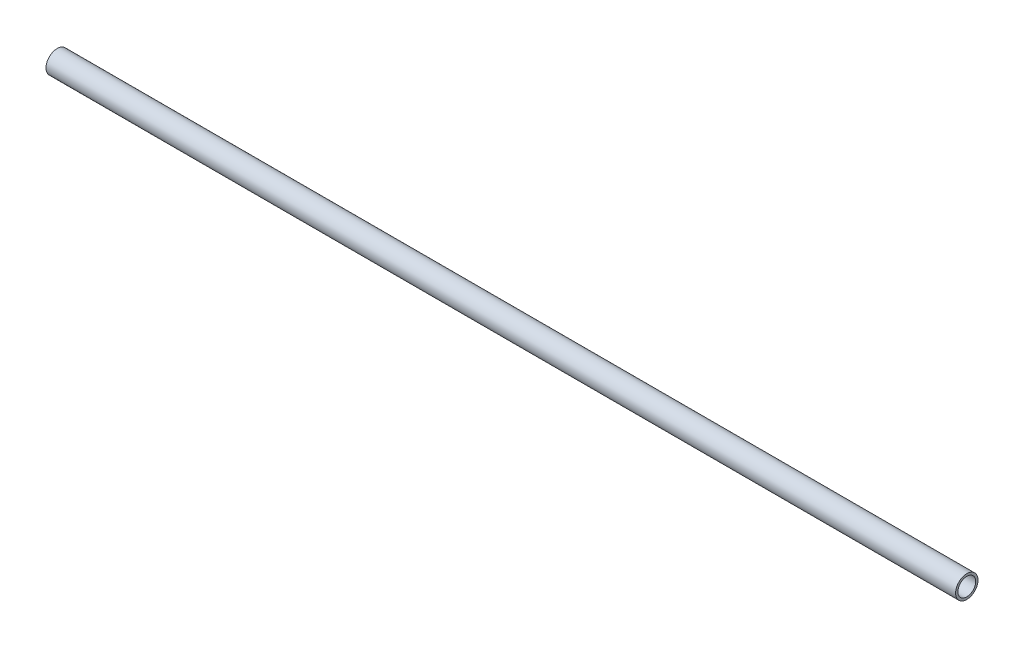
ISO-10303-21;
HEADER;
FILE_DESCRIPTION(('STEP AP214'),'2;1');
FILE_NAME('part.step','',(''),(''),'','','');
FILE_SCHEMA(('AUTOMOTIVE_DESIGN { 1 0 10303 214 1 1 1 1 }'));
ENDSEC;
DATA;
#1=APPLICATION_CONTEXT('core data for automotive mechanical design processes');
#2=APPLICATION_PROTOCOL_DEFINITION('international standard','automotive_design',2000,#1);
#3=PRODUCT_CONTEXT('',#1,'mechanical');
#4=PRODUCT('Part','Part','',(#3));
#5=PRODUCT_RELATED_PRODUCT_CATEGORY('part','',(#4));
#6=PRODUCT_DEFINITION_FORMATION('','',#4);
#7=PRODUCT_DEFINITION_CONTEXT('part definition',#1,'design');
#8=PRODUCT_DEFINITION('design','',#6,#7);
#9=PRODUCT_DEFINITION_SHAPE('','',#8);
#10=(LENGTH_UNIT() NAMED_UNIT(*) SI_UNIT(.MILLI.,.METRE.));
#11=(NAMED_UNIT(*) PLANE_ANGLE_UNIT() SI_UNIT($,.RADIAN.));
#12=(NAMED_UNIT(*) SI_UNIT($,.STERADIAN.) SOLID_ANGLE_UNIT());
#13=UNCERTAINTY_MEASURE_WITH_UNIT(LENGTH_MEASURE(1.E-05),#10,'distance_accuracy_value','');
#14=(GEOMETRIC_REPRESENTATION_CONTEXT(3) GLOBAL_UNCERTAINTY_ASSIGNED_CONTEXT((#13)) GLOBAL_UNIT_ASSIGNED_CONTEXT((#10,
#11,#12)) REPRESENTATION_CONTEXT('',''));
#15=CARTESIAN_POINT('',(0.,0.,0.));
#16=DIRECTION('',(0.,0.,1.));
#17=DIRECTION('',(1.,0.,0.));
#18=AXIS2_PLACEMENT_3D('',#15,#16,#17);
#19=CARTESIAN_POINT('',(980.,0.,0.));
#20=DIRECTION('',(1.,0.,0.));
#21=DIRECTION('',(0.,0.,-1.));
#22=AXIS2_PLACEMENT_3D('',#19,#20,#21);
#23=PLANE('',#22);
#24=CARTESIAN_POINT('',(980.,0.,0.));
#25=DIRECTION('',(1.,0.,0.));
#26=DIRECTION('',(0.,0.,-1.));
#27=AXIS2_PLACEMENT_3D('',#24,#25,#26);
#28=CIRCLE('',#27,24.15);
#29=CARTESIAN_POINT('',(980.,0.,-24.15));
#30=VERTEX_POINT('',#29);
#31=EDGE_CURVE('E10',#30,#30,#28,.T.);
#32=ORIENTED_EDGE('',*,*,#31,.T.);
#33=EDGE_LOOP('',(#32));
#34=FACE_BOUND('',#33,.T.);
#35=CARTESIAN_POINT('',(980.,0.,0.));
#36=DIRECTION('',(1.,0.,0.));
#37=DIRECTION('',(0.,0.,-1.));
#38=AXIS2_PLACEMENT_3D('',#35,#36,#37);
#39=CIRCLE('',#38,19.15);
#40=CARTESIAN_POINT('',(980.,0.,-19.15));
#41=VERTEX_POINT('',#40);
#42=EDGE_CURVE('E39',#41,#41,#39,.T.);
#43=ORIENTED_EDGE('',*,*,#42,.F.);
#44=EDGE_LOOP('',(#43));
#45=FACE_BOUND('',#44,.T.);
#46=ADVANCED_FACE('F28',(#34,#45),#23,.T.);
#47=CARTESIAN_POINT('',(-980.,0.,0.));
#48=DIRECTION('',(1.,0.,0.));
#49=DIRECTION('',(0.,0.,-1.));
#50=AXIS2_PLACEMENT_3D('',#47,#48,#49);
#51=PLANE('',#50);
#52=CARTESIAN_POINT('',(-980.,0.,0.));
#53=DIRECTION('',(1.,0.,0.));
#54=DIRECTION('',(0.,0.,-1.));
#55=AXIS2_PLACEMENT_3D('',#52,#53,#54);
#56=CIRCLE('',#55,24.15);
#57=CARTESIAN_POINT('',(-980.,0.,-24.15));
#58=VERTEX_POINT('',#57);
#59=EDGE_CURVE('E32',#58,#58,#56,.T.);
#60=ORIENTED_EDGE('',*,*,#59,.F.);
#61=EDGE_LOOP('',(#60));
#62=FACE_BOUND('',#61,.T.);
#63=CARTESIAN_POINT('',(-980.,0.,0.));
#64=DIRECTION('',(1.,0.,0.));
#65=DIRECTION('',(0.,0.,-1.));
#66=AXIS2_PLACEMENT_3D('',#63,#64,#65);
#67=CIRCLE('',#66,19.15);
#68=CARTESIAN_POINT('',(-980.,0.,-19.15));
#69=VERTEX_POINT('',#68);
#70=EDGE_CURVE('E41',#69,#69,#67,.T.);
#71=ORIENTED_EDGE('',*,*,#70,.T.);
#72=EDGE_LOOP('',(#71));
#73=FACE_BOUND('',#72,.T.);
#74=ADVANCED_FACE('F51',(#62,#73),#51,.F.);
#75=CARTESIAN_POINT('',(980.,0.,0.));
#76=DIRECTION('',(-1.,0.,0.));
#77=DIRECTION('',(0.,0.,1.));
#78=AXIS2_PLACEMENT_3D('',#75,#76,#77);
#79=CYLINDRICAL_SURFACE('',#78,24.15);
#80=ORIENTED_EDGE('',*,*,#31,.F.);
#81=EDGE_LOOP('',(#80));
#82=FACE_BOUND('',#81,.T.);
#83=ORIENTED_EDGE('',*,*,#59,.T.);
#84=EDGE_LOOP('',(#83));
#85=FACE_BOUND('',#84,.T.);
#86=ADVANCED_FACE('F30',(#82,#85),#79,.T.);
#87=CARTESIAN_POINT('',(980.,0.,0.));
#88=DIRECTION('',(-1.,0.,0.));
#89=DIRECTION('',(0.,0.,1.));
#90=AXIS2_PLACEMENT_3D('',#87,#88,#89);
#91=CYLINDRICAL_SURFACE('',#90,19.15);
#92=ORIENTED_EDGE('',*,*,#42,.T.);
#93=EDGE_LOOP('',(#92));
#94=FACE_BOUND('',#93,.T.);
#95=ORIENTED_EDGE('',*,*,#70,.F.);
#96=EDGE_LOOP('',(#95));
#97=FACE_BOUND('',#96,.T.);
#98=ADVANCED_FACE('F47',(#94,#97),#91,.F.);
#99=CLOSED_SHELL('',(#46,#74,#86,#98));
#100=MANIFOLD_SOLID_BREP('B2',#99);
#101=ADVANCED_BREP_SHAPE_REPRESENTATION('',(#18,#100),#14);
#102=SHAPE_DEFINITION_REPRESENTATION(#9,#101);
ENDSEC;
END-ISO-10303-21;
